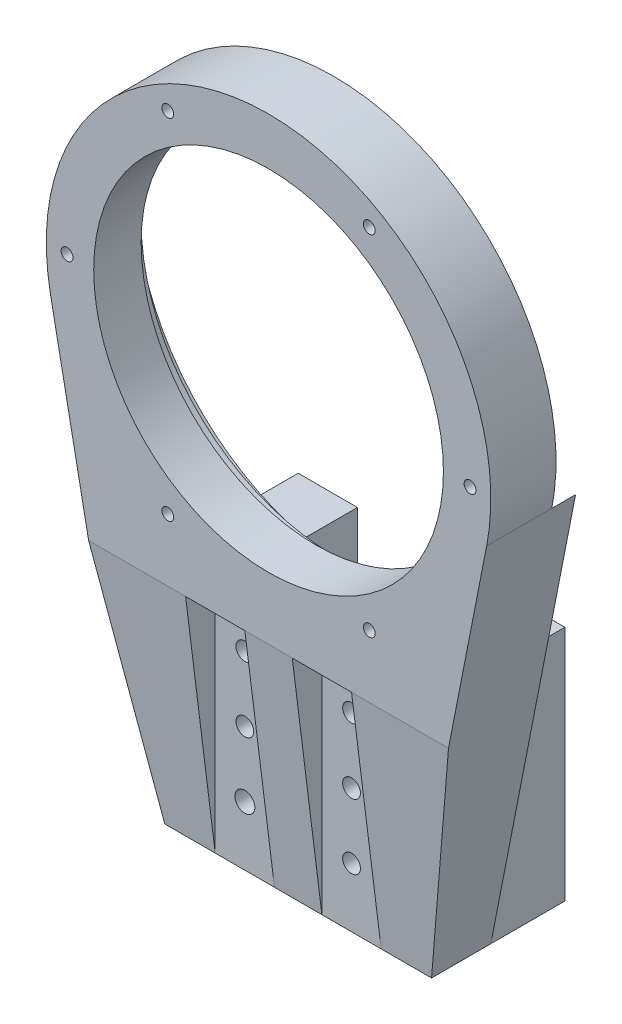
ISO-10303-21;
HEADER;
FILE_DESCRIPTION(('STEP AP214'),'2;1');
FILE_NAME('part.step','',(''),(''),'','','');
FILE_SCHEMA(('AUTOMOTIVE_DESIGN { 1 0 10303 214 1 1 1 1 }'));
ENDSEC;
DATA;
#1=APPLICATION_CONTEXT('core data for automotive mechanical design processes');
#2=APPLICATION_PROTOCOL_DEFINITION('international standard','automotive_design',2000,#1);
#3=PRODUCT_CONTEXT('',#1,'mechanical');
#4=PRODUCT('Part','Part','',(#3));
#5=PRODUCT_RELATED_PRODUCT_CATEGORY('part','',(#4));
#6=PRODUCT_DEFINITION_FORMATION('','',#4);
#7=PRODUCT_DEFINITION_CONTEXT('part definition',#1,'design');
#8=PRODUCT_DEFINITION('design','',#6,#7);
#9=PRODUCT_DEFINITION_SHAPE('','',#8);
#10=(LENGTH_UNIT() NAMED_UNIT(*) SI_UNIT(.MILLI.,.METRE.));
#11=(NAMED_UNIT(*) PLANE_ANGLE_UNIT() SI_UNIT($,.RADIAN.));
#12=(NAMED_UNIT(*) SI_UNIT($,.STERADIAN.) SOLID_ANGLE_UNIT());
#13=UNCERTAINTY_MEASURE_WITH_UNIT(LENGTH_MEASURE(1.E-05),#10,'distance_accuracy_value','');
#14=(GEOMETRIC_REPRESENTATION_CONTEXT(3) GLOBAL_UNCERTAINTY_ASSIGNED_CONTEXT((#13)) GLOBAL_UNIT_ASSIGNED_CONTEXT((#10,
#11,#12)) REPRESENTATION_CONTEXT('',''));
#15=CARTESIAN_POINT('',(0.,0.,0.));
#16=DIRECTION('',(0.,0.,1.));
#17=DIRECTION('',(1.,0.,0.));
#18=AXIS2_PLACEMENT_3D('',#15,#16,#17);
#19=CARTESIAN_POINT('',(0.,0.,0.));
#20=DIRECTION('',(0.,0.,1.));
#21=DIRECTION('',(1.,0.,0.));
#22=AXIS2_PLACEMENT_3D('',#19,#20,#21);
#23=PLANE('',#22);
#24=CARTESIAN_POINT('',(9.00000000000001,-48.,0.));
#25=DIRECTION('',(0.,0.,1.));
#26=DIRECTION('',(1.,0.,0.));
#27=AXIS2_PLACEMENT_3D('',#24,#25,#26);
#28=CIRCLE('',#27,1.5);
#29=CARTESIAN_POINT('',(10.5,-48.,0.));
#30=VERTEX_POINT('',#29);
#31=EDGE_CURVE('E250',#30,#30,#28,.T.);
#32=ORIENTED_EDGE('',*,*,#31,.T.);
#33=EDGE_LOOP('',(#32));
#34=FACE_BOUND('',#33,.T.);
#35=CARTESIAN_POINT('',(9.00000000000001,-59.,0.));
#36=DIRECTION('',(0.,0.,1.));
#37=DIRECTION('',(1.,0.,0.));
#38=AXIS2_PLACEMENT_3D('',#35,#36,#37);
#39=CIRCLE('',#38,1.5);
#40=CARTESIAN_POINT('',(10.5,-59.,0.));
#41=VERTEX_POINT('',#40);
#42=EDGE_CURVE('E244',#41,#41,#39,.T.);
#43=ORIENTED_EDGE('',*,*,#42,.T.);
#44=EDGE_LOOP('',(#43));
#45=FACE_BOUND('',#44,.T.);
#46=CARTESIAN_POINT('',(9.00000000000001,-70.,0.));
#47=DIRECTION('',(0.,0.,1.));
#48=DIRECTION('',(1.,0.,0.));
#49=AXIS2_PLACEMENT_3D('',#46,#47,#48);
#50=CIRCLE('',#49,1.5);
#51=CARTESIAN_POINT('',(10.5,-70.,0.));
#52=VERTEX_POINT('',#51);
#53=EDGE_CURVE('E238',#52,#52,#50,.T.);
#54=ORIENTED_EDGE('',*,*,#53,.T.);
#55=EDGE_LOOP('',(#54));
#56=FACE_BOUND('',#55,.T.);
#57=CARTESIAN_POINT('',(-8.99999999999999,-70.,0.));
#58=DIRECTION('',(0.,0.,1.));
#59=DIRECTION('',(1.,0.,0.));
#60=AXIS2_PLACEMENT_3D('',#57,#58,#59);
#61=CIRCLE('',#60,1.68215715956571);
#62=CARTESIAN_POINT('',(-7.31784284043428,-70.,0.));
#63=VERTEX_POINT('',#62);
#64=EDGE_CURVE('E232',#63,#63,#61,.T.);
#65=ORIENTED_EDGE('',*,*,#64,.T.);
#66=EDGE_LOOP('',(#65));
#67=FACE_BOUND('',#66,.T.);
#68=CARTESIAN_POINT('',(-8.99999999999999,-59.,0.));
#69=DIRECTION('',(0.,0.,1.));
#70=DIRECTION('',(1.,0.,0.));
#71=AXIS2_PLACEMENT_3D('',#68,#69,#70);
#72=CIRCLE('',#71,1.5);
#73=CARTESIAN_POINT('',(-7.49999999999999,-59.,0.));
#74=VERTEX_POINT('',#73);
#75=EDGE_CURVE('E225',#74,#74,#72,.T.);
#76=ORIENTED_EDGE('',*,*,#75,.T.);
#77=EDGE_LOOP('',(#76));
#78=FACE_BOUND('',#77,.T.);
#79=CARTESIAN_POINT('',(-8.99999999999999,-48.,0.));
#80=DIRECTION('',(0.,0.,1.));
#81=DIRECTION('',(1.,0.,0.));
#82=AXIS2_PLACEMENT_3D('',#79,#80,#81);
#83=CIRCLE('',#82,1.5);
#84=CARTESIAN_POINT('',(-7.49999999999999,-48.,0.));
#85=VERTEX_POINT('',#84);
#86=EDGE_CURVE('E255',#85,#85,#83,.T.);
#87=ORIENTED_EDGE('',*,*,#86,.T.);
#88=EDGE_LOOP('',(#87));
#89=FACE_BOUND('',#88,.T.);
#90=DIRECTION('',(0.,1.,0.));
#91=VECTOR('',#90,1.);
#92=CARTESIAN_POINT('',(-22.5,-80.,0.));
#93=LINE('',#92,#91);
#94=CARTESIAN_POINT('',(-22.5,-80.,0.));
#95=VERTEX_POINT('',#94);
#96=CARTESIAN_POINT('',(-22.5,-40.,0.));
#97=VERTEX_POINT('',#96);
#98=EDGE_CURVE('E191',#95,#97,#93,.T.);
#99=ORIENTED_EDGE('',*,*,#98,.F.);
#100=DIRECTION('',(-0.192775433904576,0.98124290167262,0.));
#101=VECTOR('',#100,1.);
#102=CARTESIAN_POINT('',(-36.7966088127232,-7.22907877142159,0.));
#103=LINE('',#102,#101);
#104=CARTESIAN_POINT('',(-36.7966088127232,-7.2290787714216,0.));
#105=VERTEX_POINT('',#104);
#106=EDGE_CURVE('E373',#95,#105,#103,.T.);
#107=ORIENTED_EDGE('',*,*,#106,.T.);
#108=CARTESIAN_POINT('',(0.,0.,0.));
#109=DIRECTION('',(0.,0.,-1.));
#110=DIRECTION('',(-1.,0.,0.));
#111=AXIS2_PLACEMENT_3D('',#108,#109,#110);
#112=CIRCLE('',#111,37.5);
#113=CARTESIAN_POINT('',(36.7966088127232,-7.22907877142159,0.));
#114=VERTEX_POINT('',#113);
#115=EDGE_CURVE('E309',#114,#105,#112,.T.);
#116=ORIENTED_EDGE('',*,*,#115,.F.);
#117=DIRECTION('',(0.192775433904576,0.98124290167262,0.));
#118=VECTOR('',#117,1.);
#119=CARTESIAN_POINT('',(36.7966088127232,-7.22907877142159,0.));
#120=LINE('',#119,#118);
#121=CARTESIAN_POINT('',(22.5,-80.,0.));
#122=VERTEX_POINT('',#121);
#123=EDGE_CURVE('E365',#122,#114,#120,.T.);
#124=ORIENTED_EDGE('',*,*,#123,.F.);
#125=DIRECTION('',(0.,-1.,0.));
#126=VECTOR('',#125,1.);
#127=CARTESIAN_POINT('',(22.5,-80.,0.));
#128=LINE('',#127,#126);
#129=CARTESIAN_POINT('',(22.5,-40.,0.));
#130=VERTEX_POINT('',#129);
#131=EDGE_CURVE('E61',#130,#122,#128,.T.);
#132=ORIENTED_EDGE('',*,*,#131,.F.);
#133=DIRECTION('',(1.,0.,0.));
#134=VECTOR('',#133,1.);
#135=CARTESIAN_POINT('',(22.5,-40.,0.));
#136=LINE('',#135,#134);
#137=CARTESIAN_POINT('',(12.5,-40.,0.));
#138=VERTEX_POINT('',#137);
#139=EDGE_CURVE('E196',#138,#130,#136,.T.);
#140=ORIENTED_EDGE('',*,*,#139,.F.);
#141=DIRECTION('',(0.,1.,0.));
#142=VECTOR('',#141,1.);
#143=CARTESIAN_POINT('',(12.5,-80.,0.));
#144=LINE('',#143,#142);
#145=CARTESIAN_POINT('',(12.5,-80.,0.));
#146=VERTEX_POINT('',#145);
#147=EDGE_CURVE('E193',#146,#138,#144,.T.);
#148=ORIENTED_EDGE('',*,*,#147,.F.);
#149=DIRECTION('',(1.,0.,0.));
#150=VECTOR('',#149,1.);
#151=CARTESIAN_POINT('',(0.,-80.,0.));
#152=LINE('',#151,#150);
#153=CARTESIAN_POINT('',(-12.5,-80.,0.));
#154=VERTEX_POINT('',#153);
#155=EDGE_CURVE('E376',#154,#146,#152,.T.);
#156=ORIENTED_EDGE('',*,*,#155,.F.);
#157=DIRECTION('',(0.,-1.,0.));
#158=VECTOR('',#157,1.);
#159=CARTESIAN_POINT('',(-12.5,-80.,0.));
#160=LINE('',#159,#158);
#161=CARTESIAN_POINT('',(-12.5,-40.,0.));
#162=VERTEX_POINT('',#161);
#163=EDGE_CURVE('E187',#162,#154,#160,.T.);
#164=ORIENTED_EDGE('',*,*,#163,.F.);
#165=DIRECTION('',(1.,0.,0.));
#166=VECTOR('',#165,1.);
#167=CARTESIAN_POINT('',(-22.5,-40.,0.));
#168=LINE('',#167,#166);
#169=EDGE_CURVE('E509',#97,#162,#168,.T.);
#170=ORIENTED_EDGE('',*,*,#169,.F.);
#171=EDGE_LOOP('',(#99,#107,#116,#124,#132,#140,#148,#156,#164,#170));
#172=FACE_BOUND('',#171,.T.);
#173=ADVANCED_FACE('F38',(#34,#45,#56,#67,#78,#89,#172),#23,.F.);
#174=CARTESIAN_POINT('',(35.,-40.,15.));
#175=DIRECTION('',(0.,-0.124034734589208,0.992277876713668));
#176=DIRECTION('',(0.,-0.992277876713668,-0.124034734589208));
#177=AXIS2_PLACEMENT_3D('',#174,#175,#176);
#178=PLANE('',#177);
#179=DIRECTION('',(0.,-0.992277876713668,-0.124034734589208));
#180=VECTOR('',#179,1.);
#181=CARTESIAN_POINT('',(-14.,-40.,15.));
#182=LINE('',#181,#180);
#183=CARTESIAN_POINT('',(-14.,-40.,15.));
#184=VERTEX_POINT('',#183);
#185=CARTESIAN_POINT('',(-14.,-80.,10.));
#186=VERTEX_POINT('',#185);
#187=EDGE_CURVE('E11',#184,#186,#182,.T.);
#188=ORIENTED_EDGE('',*,*,#187,.F.);
#189=DIRECTION('',(1.,0.,0.));
#190=VECTOR('',#189,1.);
#191=CARTESIAN_POINT('',(0.,-40.,15.));
#192=LINE('',#191,#190);
#193=CARTESIAN_POINT('',(-30.3584184843925,-40.,15.));
#194=VERTEX_POINT('',#193);
#195=EDGE_CURVE('E395',#194,#184,#192,.T.);
#196=ORIENTED_EDGE('',*,*,#195,.F.);
#197=DIRECTION('',(-0.191341503775851,0.973944078727149,0.121743009840894));
#198=VECTOR('',#197,1.);
#199=CARTESIAN_POINT('',(-36.7011860732528,-7.71478840706899,19.0356514491164));
#200=LINE('',#199,#198);
#201=CARTESIAN_POINT('',(-22.5,-80.,10.));
#202=VERTEX_POINT('',#201);
#203=EDGE_CURVE('E306',#202,#194,#200,.T.);
#204=ORIENTED_EDGE('',*,*,#203,.F.);
#205=DIRECTION('',(-1.,0.,0.));
#206=VECTOR('',#205,1.);
#207=CARTESIAN_POINT('',(35.,-80.,10.));
#208=LINE('',#207,#206);
#209=EDGE_CURVE('E280',#186,#202,#208,.T.);
#210=ORIENTED_EDGE('',*,*,#209,.F.);
#211=EDGE_LOOP('',(#188,#196,#204,#210));
#212=FACE_BOUND('',#211,.T.);
#213=ADVANCED_FACE('F426',(#212),#178,.T.);
#214=DIRECTION('',(0.,0.992277876713668,0.124034734589208));
#215=VECTOR('',#214,1.);
#216=CARTESIAN_POINT('',(-3.99999999999999,-40.,15.));
#217=LINE('',#216,#215);
#218=CARTESIAN_POINT('',(-3.99999999999999,-80.,10.));
#219=VERTEX_POINT('',#218);
#220=CARTESIAN_POINT('',(-3.99999999999999,-40.,15.));
#221=VERTEX_POINT('',#220);
#222=EDGE_CURVE('E46',#219,#221,#217,.T.);
#223=ORIENTED_EDGE('',*,*,#222,.F.);
#224=CARTESIAN_POINT('',(4.00000000000001,-80.,10.));
#225=VERTEX_POINT('',#224);
#226=EDGE_CURVE('E303',#225,#219,#208,.T.);
#227=ORIENTED_EDGE('',*,*,#226,.F.);
#228=DIRECTION('',(0.,-0.992277876713668,-0.124034734589208));
#229=VECTOR('',#228,1.);
#230=CARTESIAN_POINT('',(4.00000000000001,-40.,15.));
#231=LINE('',#230,#229);
#232=CARTESIAN_POINT('',(4.00000000000001,-40.,15.));
#233=VERTEX_POINT('',#232);
#234=EDGE_CURVE('E402',#233,#225,#231,.T.);
#235=ORIENTED_EDGE('',*,*,#234,.F.);
#236=EDGE_CURVE('E399',#221,#233,#192,.T.);
#237=ORIENTED_EDGE('',*,*,#236,.F.);
#238=EDGE_LOOP('',(#223,#227,#235,#237));
#239=FACE_BOUND('',#238,.T.);
#240=ADVANCED_FACE('F414',(#239),#178,.T.);
#241=CARTESIAN_POINT('',(-36.7966088127232,-7.22907877142159,15.));
#242=DIRECTION('',(-0.98124290167262,-0.192775433904576,0.));
#243=DIRECTION('',(0.192775433904576,-0.98124290167262,0.));
#244=AXIS2_PLACEMENT_3D('',#241,#242,#243);
#245=PLANE('',#244);
#246=DIRECTION('',(0.,0.,-1.));
#247=VECTOR('',#246,1.);
#248=CARTESIAN_POINT('',(-22.5,-80.,15.));
#249=LINE('',#248,#247);
#250=EDGE_CURVE('E384',#202,#95,#249,.T.);
#251=ORIENTED_EDGE('',*,*,#250,.F.);
#252=ORIENTED_EDGE('',*,*,#203,.T.);
#253=DIRECTION('',(-0.192775433904576,0.98124290167262,0.));
#254=VECTOR('',#253,1.);
#255=CARTESIAN_POINT('',(-36.7966088127232,-7.22907877142159,15.));
#256=LINE('',#255,#254);
#257=CARTESIAN_POINT('',(-36.7966088127232,-7.2290787714216,15.));
#258=VERTEX_POINT('',#257);
#259=EDGE_CURVE('E368',#194,#258,#256,.T.);
#260=ORIENTED_EDGE('',*,*,#259,.T.);
#261=DIRECTION('',(0.,0.,-1.));
#262=VECTOR('',#261,1.);
#263=CARTESIAN_POINT('',(-36.7966088127232,-7.2290787714216,15.));
#264=LINE('',#263,#262);
#265=CARTESIAN_POINT('',(-36.7966088127233,-7.2290787714216,4.));
#266=VERTEX_POINT('',#265);
#267=EDGE_CURVE('E387',#258,#266,#264,.T.);
#268=ORIENTED_EDGE('',*,*,#267,.T.);
#269=DIRECTION('',(0.,0.,-1.));
#270=VECTOR('',#269,1.);
#271=CARTESIAN_POINT('',(-36.7966088127233,-7.2290787714216,4.));
#272=LINE('',#271,#270);
#273=EDGE_CURVE('E336',#266,#105,#272,.T.);
#274=ORIENTED_EDGE('',*,*,#273,.T.);
#275=ORIENTED_EDGE('',*,*,#106,.F.);
#276=EDGE_LOOP('',(#251,#252,#260,#268,#274,#275));
#277=FACE_BOUND('',#276,.T.);
#278=ADVANCED_FACE('F477',(#277),#245,.T.);
#279=CARTESIAN_POINT('',(0.,-80.,15.));
#280=DIRECTION('',(0.,1.,0.));
#281=DIRECTION('',(0.,0.,1.));
#282=AXIS2_PLACEMENT_3D('',#279,#280,#281);
#283=PLANE('',#282);
#284=CARTESIAN_POINT('',(22.5,-80.,10.));
#285=VERTEX_POINT('',#284);
#286=CARTESIAN_POINT('',(14.,-80.,10.));
#287=VERTEX_POINT('',#286);
#288=EDGE_CURVE('E299',#285,#287,#208,.T.);
#289=ORIENTED_EDGE('',*,*,#288,.T.);
#290=DIRECTION('',(1.,0.,0.));
#291=VECTOR('',#290,1.);
#292=CARTESIAN_POINT('',(4.00000000000001,-80.,10.));
#293=LINE('',#292,#291);
#294=EDGE_CURVE('E285',#225,#287,#293,.T.);
#295=ORIENTED_EDGE('',*,*,#294,.F.);
#296=ORIENTED_EDGE('',*,*,#226,.T.);
#297=DIRECTION('',(1.,0.,0.));
#298=VECTOR('',#297,1.);
#299=CARTESIAN_POINT('',(-14.,-80.,10.));
#300=LINE('',#299,#298);
#301=EDGE_CURVE('E264',#186,#219,#300,.T.);
#302=ORIENTED_EDGE('',*,*,#301,.F.);
#303=ORIENTED_EDGE('',*,*,#209,.T.);
#304=ORIENTED_EDGE('',*,*,#250,.T.);
#305=DIRECTION('',(0.,0.,1.));
#306=VECTOR('',#305,1.);
#307=CARTESIAN_POINT('',(-22.5,-80.,-12.5));
#308=LINE('',#307,#306);
#309=CARTESIAN_POINT('',(-22.5,-80.,-12.5));
#310=VERTEX_POINT('',#309);
#311=EDGE_CURVE('E504',#310,#95,#308,.T.);
#312=ORIENTED_EDGE('',*,*,#311,.F.);
#313=DIRECTION('',(-1.,0.,0.));
#314=VECTOR('',#313,1.);
#315=CARTESIAN_POINT('',(-22.5,-80.,-12.5));
#316=LINE('',#315,#314);
#317=CARTESIAN_POINT('',(-12.5,-80.,-12.5));
#318=VERTEX_POINT('',#317);
#319=EDGE_CURVE('E184',#318,#310,#316,.T.);
#320=ORIENTED_EDGE('',*,*,#319,.F.);
#321=DIRECTION('',(0.,0.,1.));
#322=VECTOR('',#321,1.);
#323=CARTESIAN_POINT('',(-12.5,-80.,-12.5));
#324=LINE('',#323,#322);
#325=EDGE_CURVE('E53',#318,#154,#324,.T.);
#326=ORIENTED_EDGE('',*,*,#325,.T.);
#327=ORIENTED_EDGE('',*,*,#155,.T.);
#328=DIRECTION('',(0.,0.,1.));
#329=VECTOR('',#328,1.);
#330=CARTESIAN_POINT('',(12.5,-80.,-12.5));
#331=LINE('',#330,#329);
#332=CARTESIAN_POINT('',(12.5,-80.,-12.5));
#333=VERTEX_POINT('',#332);
#334=EDGE_CURVE('E221',#333,#146,#331,.T.);
#335=ORIENTED_EDGE('',*,*,#334,.F.);
#336=DIRECTION('',(-1.,0.,0.));
#337=VECTOR('',#336,1.);
#338=CARTESIAN_POINT('',(12.5,-80.,-12.5));
#339=LINE('',#338,#337);
#340=CARTESIAN_POINT('',(22.5,-80.,-12.5));
#341=VERTEX_POINT('',#340);
#342=EDGE_CURVE('E201',#341,#333,#339,.T.);
#343=ORIENTED_EDGE('',*,*,#342,.F.);
#344=DIRECTION('',(0.,0.,1.));
#345=VECTOR('',#344,1.);
#346=CARTESIAN_POINT('',(22.5,-80.,-12.5));
#347=LINE('',#346,#345);
#348=EDGE_CURVE('E209',#341,#122,#347,.T.);
#349=ORIENTED_EDGE('',*,*,#348,.T.);
#350=DIRECTION('',(0.,0.,-1.));
#351=VECTOR('',#350,1.);
#352=CARTESIAN_POINT('',(22.5,-80.,15.));
#353=LINE('',#352,#351);
#354=EDGE_CURVE('E382',#285,#122,#353,.T.);
#355=ORIENTED_EDGE('',*,*,#354,.F.);
#356=EDGE_LOOP('',(#289,#295,#296,#302,#303,#304,#312,#320,#326,#327,#335,#343,#349,#355));
#357=FACE_BOUND('',#356,.T.);
#358=ADVANCED_FACE('F433',(#357),#283,.F.);
#359=CARTESIAN_POINT('',(36.7966088127232,-7.22907877142159,15.));
#360=DIRECTION('',(-0.98124290167262,0.192775433904576,0.));
#361=DIRECTION('',(-0.192775433904576,-0.98124290167262,0.));
#362=AXIS2_PLACEMENT_3D('',#359,#360,#361);
#363=PLANE('',#362);
#364=DIRECTION('',(0.191341503775851,0.973944078727149,0.121743009840894));
#365=VECTOR('',#364,1.);
#366=CARTESIAN_POINT('',(36.7011860732528,-7.71478840706898,19.0356514491164));
#367=LINE('',#366,#365);
#368=CARTESIAN_POINT('',(30.3584184843925,-40.,15.));
#369=VERTEX_POINT('',#368);
#370=EDGE_CURVE('E302',#285,#369,#367,.T.);
#371=ORIENTED_EDGE('',*,*,#370,.F.);
#372=ORIENTED_EDGE('',*,*,#354,.T.);
#373=ORIENTED_EDGE('',*,*,#123,.T.);
#374=DIRECTION('',(0.,0.,-1.));
#375=VECTOR('',#374,1.);
#376=CARTESIAN_POINT('',(36.7966088127233,-7.22907877142159,4.));
#377=LINE('',#376,#375);
#378=CARTESIAN_POINT('',(36.7966088127233,-7.22907877142159,4.));
#379=VERTEX_POINT('',#378);
#380=EDGE_CURVE('E334',#379,#114,#377,.T.);
#381=ORIENTED_EDGE('',*,*,#380,.F.);
#382=DIRECTION('',(0.,0.,-1.));
#383=VECTOR('',#382,1.);
#384=CARTESIAN_POINT('',(36.7966088127232,-7.22907877142159,15.));
#385=LINE('',#384,#383);
#386=CARTESIAN_POINT('',(36.7966088127232,-7.22907877142159,15.));
#387=VERTEX_POINT('',#386);
#388=EDGE_CURVE('E372',#387,#379,#385,.T.);
#389=ORIENTED_EDGE('',*,*,#388,.F.);
#390=DIRECTION('',(0.192775433904576,0.98124290167262,0.));
#391=VECTOR('',#390,1.);
#392=CARTESIAN_POINT('',(36.7966088127232,-7.22907877142159,15.));
#393=LINE('',#392,#391);
#394=EDGE_CURVE('E370',#369,#387,#393,.T.);
#395=ORIENTED_EDGE('',*,*,#394,.F.);
#396=EDGE_LOOP('',(#371,#372,#373,#381,#389,#395));
#397=FACE_BOUND('',#396,.T.);
#398=ADVANCED_FACE('F471',(#397),#363,.F.);
#399=CARTESIAN_POINT('',(0.,0.,15.));
#400=DIRECTION('',(0.,0.,1.));
#401=DIRECTION('',(1.,0.,0.));
#402=AXIS2_PLACEMENT_3D('',#399,#400,#401);
#403=PLANE('',#402);
#404=CARTESIAN_POINT('',(-17.0000000000002,29.4448637286708,15.));
#405=DIRECTION('',(0.,0.,1.));
#406=DIRECTION('',(1.,0.,0.));
#407=AXIS2_PLACEMENT_3D('',#404,#405,#406);
#408=CIRCLE('',#407,1.00000000000001);
#409=CARTESIAN_POINT('',(-16.0000000000001,29.4448637286708,15.));
#410=VERTEX_POINT('',#409);
#411=EDGE_CURVE('E339',#410,#410,#408,.T.);
#412=ORIENTED_EDGE('',*,*,#411,.F.);
#413=EDGE_LOOP('',(#412));
#414=FACE_BOUND('',#413,.T.);
#415=CARTESIAN_POINT('',(-34.,0.,15.));
#416=DIRECTION('',(0.,0.,1.));
#417=DIRECTION('',(1.,0.,0.));
#418=AXIS2_PLACEMENT_3D('',#415,#416,#417);
#419=CIRCLE('',#418,0.999999999999992);
#420=CARTESIAN_POINT('',(-33.,0.,15.));
#421=VERTEX_POINT('',#420);
#422=EDGE_CURVE('E350',#421,#421,#419,.T.);
#423=ORIENTED_EDGE('',*,*,#422,.F.);
#424=EDGE_LOOP('',(#423));
#425=FACE_BOUND('',#424,.T.);
#426=CARTESIAN_POINT('',(-17.0000000000001,-29.4448637286708,15.));
#427=DIRECTION('',(0.,0.,1.));
#428=DIRECTION('',(1.,0.,0.));
#429=AXIS2_PLACEMENT_3D('',#426,#427,#428);
#430=CIRCLE('',#429,0.999999999999999);
#431=CARTESIAN_POINT('',(-16.0000000000001,-29.4448637286708,15.));
#432=VERTEX_POINT('',#431);
#433=EDGE_CURVE('E347',#432,#432,#430,.T.);
#434=ORIENTED_EDGE('',*,*,#433,.F.);
#435=EDGE_LOOP('',(#434));
#436=FACE_BOUND('',#435,.T.);
#437=CARTESIAN_POINT('',(17.0000000000001,-29.4448637286708,15.));
#438=DIRECTION('',(0.,0.,1.));
#439=DIRECTION('',(1.,0.,0.));
#440=AXIS2_PLACEMENT_3D('',#437,#438,#439);
#441=CIRCLE('',#440,0.999999999999994);
#442=CARTESIAN_POINT('',(18.0000000000001,-29.4448637286708,15.));
#443=VERTEX_POINT('',#442);
#444=EDGE_CURVE('E344',#443,#443,#441,.T.);
#445=ORIENTED_EDGE('',*,*,#444,.F.);
#446=EDGE_LOOP('',(#445));
#447=FACE_BOUND('',#446,.T.);
#448=CARTESIAN_POINT('',(34.,0.,15.));
#449=DIRECTION('',(0.,0.,1.));
#450=DIRECTION('',(1.,0.,0.));
#451=AXIS2_PLACEMENT_3D('',#448,#449,#450);
#452=CIRCLE('',#451,0.999999999999998);
#453=CARTESIAN_POINT('',(35.,0.,15.));
#454=VERTEX_POINT('',#453);
#455=EDGE_CURVE('E340',#454,#454,#452,.T.);
#456=ORIENTED_EDGE('',*,*,#455,.F.);
#457=EDGE_LOOP('',(#456));
#458=FACE_BOUND('',#457,.T.);
#459=CARTESIAN_POINT('',(17.0000000000001,29.4448637286708,15.));
#460=DIRECTION('',(0.,0.,1.));
#461=DIRECTION('',(1.,0.,0.));
#462=AXIS2_PLACEMENT_3D('',#459,#460,#461);
#463=CIRCLE('',#462,1.00000000000001);
#464=CARTESIAN_POINT('',(18.0000000000001,29.4448637286708,15.));
#465=VERTEX_POINT('',#464);
#466=EDGE_CURVE('E343',#465,#465,#463,.T.);
#467=ORIENTED_EDGE('',*,*,#466,.F.);
#468=EDGE_LOOP('',(#467));
#469=FACE_BOUND('',#468,.T.);
#470=CARTESIAN_POINT('',(0.,0.,15.));
#471=DIRECTION('',(0.,0.,1.));
#472=DIRECTION('',(1.,0.,0.));
#473=AXIS2_PLACEMENT_3D('',#470,#471,#472);
#474=CIRCLE('',#473,29.5);
#475=CARTESIAN_POINT('',(29.5,0.,15.));
#476=VERTEX_POINT('',#475);
#477=EDGE_CURVE('E361',#476,#476,#474,.T.);
#478=ORIENTED_EDGE('',*,*,#477,.F.);
#479=EDGE_LOOP('',(#478));
#480=FACE_BOUND('',#479,.T.);
#481=ORIENTED_EDGE('',*,*,#259,.F.);
#482=ORIENTED_EDGE('',*,*,#195,.T.);
#483=DIRECTION('',(-1.,0.,0.));
#484=VECTOR('',#483,1.);
#485=CARTESIAN_POINT('',(-14.,-40.,15.));
#486=LINE('',#485,#484);
#487=EDGE_CURVE('E265',#221,#184,#486,.T.);
#488=ORIENTED_EDGE('',*,*,#487,.F.);
#489=ORIENTED_EDGE('',*,*,#236,.T.);
#490=DIRECTION('',(-1.,0.,0.));
#491=VECTOR('',#490,1.);
#492=CARTESIAN_POINT('',(4.00000000000001,-40.,15.));
#493=LINE('',#492,#491);
#494=CARTESIAN_POINT('',(14.,-40.,15.));
#495=VERTEX_POINT('',#494);
#496=EDGE_CURVE('E258',#495,#233,#493,.T.);
#497=ORIENTED_EDGE('',*,*,#496,.F.);
#498=EDGE_CURVE('E390',#495,#369,#192,.T.);
#499=ORIENTED_EDGE('',*,*,#498,.T.);
#500=ORIENTED_EDGE('',*,*,#394,.T.);
#501=CARTESIAN_POINT('',(0.,0.,15.));
#502=DIRECTION('',(0.,0.,1.));
#503=DIRECTION('',(1.,0.,0.));
#504=AXIS2_PLACEMENT_3D('',#501,#502,#503);
#505=CIRCLE('',#504,37.5);
#506=EDGE_CURVE('E364',#387,#258,#505,.T.);
#507=ORIENTED_EDGE('',*,*,#506,.T.);
#508=EDGE_LOOP('',(#481,#482,#488,#489,#497,#499,#500,#507));
#509=FACE_BOUND('',#508,.T.);
#510=ADVANCED_FACE('F418',(#414,#425,#436,#447,#458,#469,#480,#509),#403,.T.);
#511=CARTESIAN_POINT('',(0.,0.,15.));
#512=DIRECTION('',(0.,0.,-1.));
#513=DIRECTION('',(-1.,0.,0.));
#514=AXIS2_PLACEMENT_3D('',#511,#512,#513);
#515=CYLINDRICAL_SURFACE('',#514,37.5);
#516=CARTESIAN_POINT('',(0.,0.,4.));
#517=DIRECTION('',(0.,0.,-1.));
#518=DIRECTION('',(-1.,0.,0.));
#519=AXIS2_PLACEMENT_3D('',#516,#517,#518);
#520=CIRCLE('',#519,37.5);
#521=EDGE_CURVE('E314',#266,#379,#520,.T.);
#522=ORIENTED_EDGE('',*,*,#521,.F.);
#523=ORIENTED_EDGE('',*,*,#267,.F.);
#524=ORIENTED_EDGE('',*,*,#506,.F.);
#525=ORIENTED_EDGE('',*,*,#388,.T.);
#526=EDGE_LOOP('',(#522,#523,#524,#525));
#527=FACE_BOUND('',#526,.T.);
#528=ADVANCED_FACE('F480',(#527),#515,.T.);
#529=CARTESIAN_POINT('',(0.,0.,7.));
#530=DIRECTION('',(0.,0.,-1.));
#531=DIRECTION('',(-1.,0.,0.));
#532=AXIS2_PLACEMENT_3D('',#529,#530,#531);
#533=CYLINDRICAL_SURFACE('',#532,32.5);
#534=CARTESIAN_POINT('',(0.,0.,7.));
#535=DIRECTION('',(0.,0.,-1.));
#536=DIRECTION('',(-1.,0.,0.));
#537=AXIS2_PLACEMENT_3D('',#534,#535,#536);
#538=CIRCLE('',#537,32.5);
#539=CARTESIAN_POINT('',(-32.5,0.,7.));
#540=VERTEX_POINT('',#539);
#541=EDGE_CURVE('E357',#540,#540,#538,.T.);
#542=ORIENTED_EDGE('',*,*,#541,.F.);
#543=EDGE_LOOP('',(#542));
#544=FACE_BOUND('',#543,.T.);
#545=CARTESIAN_POINT('',(0.,0.,4.));
#546=DIRECTION('',(0.,0.,-1.));
#547=DIRECTION('',(-1.,0.,0.));
#548=AXIS2_PLACEMENT_3D('',#545,#546,#547);
#549=CIRCLE('',#548,32.5);
#550=CARTESIAN_POINT('',(-32.5,0.,4.));
#551=VERTEX_POINT('',#550);
#552=EDGE_CURVE('E331',#551,#551,#549,.F.);
#553=ORIENTED_EDGE('',*,*,#552,.F.);
#554=EDGE_LOOP('',(#553));
#555=FACE_BOUND('',#554,.T.);
#556=ADVANCED_FACE('F482',(#544,#555),#533,.F.);
#557=CARTESIAN_POINT('',(17.0000000000001,29.4448637286708,0.));
#558=DIRECTION('',(0.,0.,1.));
#559=DIRECTION('',(1.,0.,0.));
#560=AXIS2_PLACEMENT_3D('',#557,#558,#559);
#561=CYLINDRICAL_SURFACE('',#560,1.00000000000001);
#562=ORIENTED_EDGE('',*,*,#466,.T.);
#563=EDGE_LOOP('',(#562));
#564=FACE_BOUND('',#563,.T.);
#565=CARTESIAN_POINT('',(17.0000000000001,29.4448637286708,4.));
#566=DIRECTION('',(0.,0.,-1.));
#567=DIRECTION('',(-1.,0.,0.));
#568=AXIS2_PLACEMENT_3D('',#565,#566,#567);
#569=CIRCLE('',#568,1.00000000000001);
#570=CARTESIAN_POINT('',(16.0000000000001,29.4448637286708,4.));
#571=VERTEX_POINT('',#570);
#572=EDGE_CURVE('E328',#571,#571,#569,.F.);
#573=ORIENTED_EDGE('',*,*,#572,.F.);
#574=EDGE_LOOP('',(#573));
#575=FACE_BOUND('',#574,.T.);
#576=ADVANCED_FACE('F488',(#564,#575),#561,.F.);
#577=CARTESIAN_POINT('',(34.,0.,0.));
#578=DIRECTION('',(0.,0.,1.));
#579=DIRECTION('',(1.,0.,0.));
#580=AXIS2_PLACEMENT_3D('',#577,#578,#579);
#581=CYLINDRICAL_SURFACE('',#580,0.999999999999998);
#582=ORIENTED_EDGE('',*,*,#455,.T.);
#583=EDGE_LOOP('',(#582));
#584=FACE_BOUND('',#583,.T.);
#585=CARTESIAN_POINT('',(34.,0.,4.));
#586=DIRECTION('',(0.,0.,-1.));
#587=DIRECTION('',(-1.,0.,0.));
#588=AXIS2_PLACEMENT_3D('',#585,#586,#587);
#589=CIRCLE('',#588,0.999999999999998);
#590=CARTESIAN_POINT('',(33.,0.,4.));
#591=VERTEX_POINT('',#590);
#592=EDGE_CURVE('E325',#591,#591,#589,.F.);
#593=ORIENTED_EDGE('',*,*,#592,.F.);
#594=EDGE_LOOP('',(#593));
#595=FACE_BOUND('',#594,.T.);
#596=ADVANCED_FACE('F811',(#584,#595),#581,.F.);
#597=CARTESIAN_POINT('',(17.0000000000001,-29.4448637286708,0.));
#598=DIRECTION('',(0.,0.,1.));
#599=DIRECTION('',(1.,0.,0.));
#600=AXIS2_PLACEMENT_3D('',#597,#598,#599);
#601=CYLINDRICAL_SURFACE('',#600,0.999999999999994);
#602=ORIENTED_EDGE('',*,*,#444,.T.);
#603=EDGE_LOOP('',(#602));
#604=FACE_BOUND('',#603,.T.);
#605=CARTESIAN_POINT('',(17.0000000000001,-29.4448637286708,4.));
#606=DIRECTION('',(0.,0.,-1.));
#607=DIRECTION('',(-1.,0.,0.));
#608=AXIS2_PLACEMENT_3D('',#605,#606,#607);
#609=CIRCLE('',#608,0.999999999999994);
#610=CARTESIAN_POINT('',(16.0000000000002,-29.4448637286708,4.));
#611=VERTEX_POINT('',#610);
#612=EDGE_CURVE('E322',#611,#611,#609,.F.);
#613=ORIENTED_EDGE('',*,*,#612,.F.);
#614=EDGE_LOOP('',(#613));
#615=FACE_BOUND('',#614,.T.);
#616=ADVANCED_FACE('F821',(#604,#615),#601,.F.);
#617=CARTESIAN_POINT('',(-17.0000000000001,-29.4448637286708,0.));
#618=DIRECTION('',(0.,0.,1.));
#619=DIRECTION('',(1.,0.,0.));
#620=AXIS2_PLACEMENT_3D('',#617,#618,#619);
#621=CYLINDRICAL_SURFACE('',#620,0.999999999999999);
#622=ORIENTED_EDGE('',*,*,#433,.T.);
#623=EDGE_LOOP('',(#622));
#624=FACE_BOUND('',#623,.T.);
#625=CARTESIAN_POINT('',(-17.0000000000001,-29.4448637286708,4.));
#626=DIRECTION('',(0.,0.,-1.));
#627=DIRECTION('',(-1.,0.,0.));
#628=AXIS2_PLACEMENT_3D('',#625,#626,#627);
#629=CIRCLE('',#628,0.999999999999999);
#630=CARTESIAN_POINT('',(-18.0000000000001,-29.4448637286708,4.));
#631=VERTEX_POINT('',#630);
#632=EDGE_CURVE('E319',#631,#631,#629,.F.);
#633=ORIENTED_EDGE('',*,*,#632,.F.);
#634=EDGE_LOOP('',(#633));
#635=FACE_BOUND('',#634,.T.);
#636=ADVANCED_FACE('F831',(#624,#635),#621,.F.);
#637=CARTESIAN_POINT('',(-34.,0.,0.));
#638=DIRECTION('',(0.,0.,1.));
#639=DIRECTION('',(1.,0.,0.));
#640=AXIS2_PLACEMENT_3D('',#637,#638,#639);
#641=CYLINDRICAL_SURFACE('',#640,0.999999999999992);
#642=ORIENTED_EDGE('',*,*,#422,.T.);
#643=EDGE_LOOP('',(#642));
#644=FACE_BOUND('',#643,.T.);
#645=CARTESIAN_POINT('',(-34.,0.,4.));
#646=DIRECTION('',(0.,0.,-1.));
#647=DIRECTION('',(-1.,0.,0.));
#648=AXIS2_PLACEMENT_3D('',#645,#646,#647);
#649=CIRCLE('',#648,0.999999999999992);
#650=CARTESIAN_POINT('',(-35.,0.,4.));
#651=VERTEX_POINT('',#650);
#652=EDGE_CURVE('E316',#651,#651,#649,.F.);
#653=ORIENTED_EDGE('',*,*,#652,.F.);
#654=EDGE_LOOP('',(#653));
#655=FACE_BOUND('',#654,.T.);
#656=ADVANCED_FACE('F841',(#644,#655),#641,.F.);
#657=CARTESIAN_POINT('',(-17.0000000000002,29.4448637286708,0.));
#658=DIRECTION('',(0.,0.,1.));
#659=DIRECTION('',(1.,0.,0.));
#660=AXIS2_PLACEMENT_3D('',#657,#658,#659);
#661=CYLINDRICAL_SURFACE('',#660,1.00000000000001);
#662=ORIENTED_EDGE('',*,*,#411,.T.);
#663=EDGE_LOOP('',(#662));
#664=FACE_BOUND('',#663,.T.);
#665=CARTESIAN_POINT('',(-17.0000000000002,29.4448637286708,4.));
#666=DIRECTION('',(0.,0.,-1.));
#667=DIRECTION('',(-1.,0.,0.));
#668=AXIS2_PLACEMENT_3D('',#665,#666,#667);
#669=CIRCLE('',#668,1.00000000000001);
#670=CARTESIAN_POINT('',(-18.0000000000002,29.4448637286708,4.));
#671=VERTEX_POINT('',#670);
#672=EDGE_CURVE('E313',#671,#671,#669,.F.);
#673=ORIENTED_EDGE('',*,*,#672,.F.);
#674=EDGE_LOOP('',(#673));
#675=FACE_BOUND('',#674,.T.);
#676=ADVANCED_FACE('F850',(#664,#675),#661,.F.);
#677=CARTESIAN_POINT('',(0.,0.,15.));
#678=DIRECTION('',(0.,0.,-1.));
#679=DIRECTION('',(-1.,0.,0.));
#680=AXIS2_PLACEMENT_3D('',#677,#678,#679);
#681=CYLINDRICAL_SURFACE('',#680,29.5);
#682=ORIENTED_EDGE('',*,*,#477,.T.);
#683=EDGE_LOOP('',(#682));
#684=FACE_BOUND('',#683,.T.);
#685=CARTESIAN_POINT('',(0.,0.,7.));
#686=DIRECTION('',(0.,0.,-1.));
#687=DIRECTION('',(-1.,0.,0.));
#688=AXIS2_PLACEMENT_3D('',#685,#686,#687);
#689=CIRCLE('',#688,29.5);
#690=CARTESIAN_POINT('',(-29.5,0.,7.));
#691=VERTEX_POINT('',#690);
#692=EDGE_CURVE('E360',#691,#691,#689,.T.);
#693=ORIENTED_EDGE('',*,*,#692,.T.);
#694=EDGE_LOOP('',(#693));
#695=FACE_BOUND('',#694,.T.);
#696=ADVANCED_FACE('F40',(#684,#695),#681,.F.);
#697=CARTESIAN_POINT('',(0.,0.,7.));
#698=DIRECTION('',(0.,0.,-1.));
#699=DIRECTION('',(-1.,0.,0.));
#700=AXIS2_PLACEMENT_3D('',#697,#698,#699);
#701=PLANE('',#700);
#702=ORIENTED_EDGE('',*,*,#692,.F.);
#703=EDGE_LOOP('',(#702));
#704=FACE_BOUND('',#703,.T.);
#705=ORIENTED_EDGE('',*,*,#541,.T.);
#706=EDGE_LOOP('',(#705));
#707=FACE_BOUND('',#706,.T.);
#708=ADVANCED_FACE('F785',(#704,#707),#701,.T.);
#709=CARTESIAN_POINT('',(0.,0.,4.));
#710=DIRECTION('',(0.,0.,-1.));
#711=DIRECTION('',(-1.,0.,0.));
#712=AXIS2_PLACEMENT_3D('',#709,#710,#711);
#713=CYLINDRICAL_SURFACE('',#712,37.5);
#714=EDGE_CURVE('E310',#379,#266,#520,.T.);
#715=ORIENTED_EDGE('',*,*,#714,.F.);
#716=ORIENTED_EDGE('',*,*,#380,.T.);
#717=ORIENTED_EDGE('',*,*,#115,.T.);
#718=ORIENTED_EDGE('',*,*,#273,.F.);
#719=EDGE_LOOP('',(#715,#716,#717,#718));
#720=FACE_BOUND('',#719,.T.);
#721=ADVANCED_FACE('F503',(#720),#713,.F.);
#722=CARTESIAN_POINT('',(0.,0.,4.));
#723=DIRECTION('',(0.,0.,-1.));
#724=DIRECTION('',(-1.,0.,0.));
#725=AXIS2_PLACEMENT_3D('',#722,#723,#724);
#726=PLANE('',#725);
#727=ORIENTED_EDGE('',*,*,#714,.T.);
#728=ORIENTED_EDGE('',*,*,#521,.T.);
#729=EDGE_LOOP('',(#727,#728));
#730=FACE_BOUND('',#729,.T.);
#731=ORIENTED_EDGE('',*,*,#672,.T.);
#732=EDGE_LOOP('',(#731));
#733=FACE_BOUND('',#732,.T.);
#734=ORIENTED_EDGE('',*,*,#652,.T.);
#735=EDGE_LOOP('',(#734));
#736=FACE_BOUND('',#735,.T.);
#737=ORIENTED_EDGE('',*,*,#632,.T.);
#738=EDGE_LOOP('',(#737));
#739=FACE_BOUND('',#738,.T.);
#740=ORIENTED_EDGE('',*,*,#612,.T.);
#741=EDGE_LOOP('',(#740));
#742=FACE_BOUND('',#741,.T.);
#743=ORIENTED_EDGE('',*,*,#592,.T.);
#744=EDGE_LOOP('',(#743));
#745=FACE_BOUND('',#744,.T.);
#746=ORIENTED_EDGE('',*,*,#572,.T.);
#747=EDGE_LOOP('',(#746));
#748=FACE_BOUND('',#747,.T.);
#749=ORIENTED_EDGE('',*,*,#552,.T.);
#750=EDGE_LOOP('',(#749));
#751=FACE_BOUND('',#750,.T.);
#752=ADVANCED_FACE('F458',(#730,#733,#736,#739,#742,#745,#748,#751),#726,.T.);
#753=DIRECTION('',(0.,0.992277876713668,0.124034734589208));
#754=VECTOR('',#753,1.);
#755=CARTESIAN_POINT('',(14.,-40.,15.));
#756=LINE('',#755,#754);
#757=EDGE_CURVE('E398',#287,#495,#756,.T.);
#758=ORIENTED_EDGE('',*,*,#757,.F.);
#759=ORIENTED_EDGE('',*,*,#288,.F.);
#760=ORIENTED_EDGE('',*,*,#370,.T.);
#761=ORIENTED_EDGE('',*,*,#498,.F.);
#762=EDGE_LOOP('',(#758,#759,#760,#761));
#763=FACE_BOUND('',#762,.T.);
#764=ADVANCED_FACE('F443',(#763),#178,.T.);
#765=CARTESIAN_POINT('',(4.00000000000001,-80.,10.));
#766=DIRECTION('',(-1.,0.,0.));
#767=DIRECTION('',(0.,-1.,0.));
#768=AXIS2_PLACEMENT_3D('',#765,#766,#767);
#769=PLANE('',#768);
#770=ORIENTED_EDGE('',*,*,#234,.T.);
#771=DIRECTION('',(0.,-1.,0.));
#772=VECTOR('',#771,1.);
#773=CARTESIAN_POINT('',(4.00000000000001,-80.,10.));
#774=LINE('',#773,#772);
#775=CARTESIAN_POINT('',(4.00000000000001,-40.,10.));
#776=VERTEX_POINT('',#775);
#777=EDGE_CURVE('E282',#776,#225,#774,.T.);
#778=ORIENTED_EDGE('',*,*,#777,.F.);
#779=DIRECTION('',(0.,0.,1.));
#780=VECTOR('',#779,1.);
#781=CARTESIAN_POINT('',(4.00000000000001,-40.,10.));
#782=LINE('',#781,#780);
#783=EDGE_CURVE('E277',#776,#233,#782,.T.);
#784=ORIENTED_EDGE('',*,*,#783,.T.);
#785=EDGE_LOOP('',(#770,#778,#784));
#786=FACE_BOUND('',#785,.T.);
#787=ADVANCED_FACE('F450',(#786),#769,.F.);
#788=CARTESIAN_POINT('',(4.00000000000001,-40.,10.));
#789=DIRECTION('',(0.,1.,0.));
#790=DIRECTION('',(0.,0.,1.));
#791=AXIS2_PLACEMENT_3D('',#788,#789,#790);
#792=PLANE('',#791);
#793=ORIENTED_EDGE('',*,*,#496,.T.);
#794=ORIENTED_EDGE('',*,*,#783,.F.);
#795=DIRECTION('',(-1.,0.,0.));
#796=VECTOR('',#795,1.);
#797=CARTESIAN_POINT('',(4.00000000000001,-40.,10.));
#798=LINE('',#797,#796);
#799=CARTESIAN_POINT('',(14.,-40.,10.));
#800=VERTEX_POINT('',#799);
#801=EDGE_CURVE('E291',#800,#776,#798,.T.);
#802=ORIENTED_EDGE('',*,*,#801,.F.);
#803=DIRECTION('',(0.,0.,1.));
#804=VECTOR('',#803,1.);
#805=CARTESIAN_POINT('',(14.,-40.,10.));
#806=LINE('',#805,#804);
#807=EDGE_CURVE('E294',#800,#495,#806,.T.);
#808=ORIENTED_EDGE('',*,*,#807,.T.);
#809=EDGE_LOOP('',(#793,#794,#802,#808));
#810=FACE_BOUND('',#809,.T.);
#811=ADVANCED_FACE('F448',(#810),#792,.F.);
#812=CARTESIAN_POINT('',(14.,-80.,10.));
#813=DIRECTION('',(1.,0.,0.));
#814=DIRECTION('',(0.,0.,-1.));
#815=AXIS2_PLACEMENT_3D('',#812,#813,#814);
#816=PLANE('',#815);
#817=ORIENTED_EDGE('',*,*,#757,.T.);
#818=ORIENTED_EDGE('',*,*,#807,.F.);
#819=DIRECTION('',(0.,1.,0.));
#820=VECTOR('',#819,1.);
#821=CARTESIAN_POINT('',(14.,-80.,10.));
#822=LINE('',#821,#820);
#823=EDGE_CURVE('E288',#287,#800,#822,.T.);
#824=ORIENTED_EDGE('',*,*,#823,.F.);
#825=EDGE_LOOP('',(#817,#818,#824));
#826=FACE_BOUND('',#825,.T.);
#827=ADVANCED_FACE('F446',(#826),#816,.F.);
#828=CARTESIAN_POINT('',(0.,0.,10.));
#829=DIRECTION('',(0.,0.,-1.));
#830=DIRECTION('',(-1.,0.,0.));
#831=AXIS2_PLACEMENT_3D('',#828,#829,#830);
#832=PLANE('',#831);
#833=CARTESIAN_POINT('',(9.00000000000001,-48.,10.));
#834=DIRECTION('',(0.,0.,1.));
#835=DIRECTION('',(1.,0.,0.));
#836=AXIS2_PLACEMENT_3D('',#833,#834,#835);
#837=CIRCLE('',#836,1.5);
#838=CARTESIAN_POINT('',(10.5,-48.,10.));
#839=VERTEX_POINT('',#838);
#840=EDGE_CURVE('E224',#839,#839,#837,.T.);
#841=ORIENTED_EDGE('',*,*,#840,.F.);
#842=EDGE_LOOP('',(#841));
#843=FACE_BOUND('',#842,.T.);
#844=CARTESIAN_POINT('',(9.00000000000001,-59.,10.));
#845=DIRECTION('',(0.,0.,1.));
#846=DIRECTION('',(1.,0.,0.));
#847=AXIS2_PLACEMENT_3D('',#844,#845,#846);
#848=CIRCLE('',#847,1.5);
#849=CARTESIAN_POINT('',(10.5,-59.,10.));
#850=VERTEX_POINT('',#849);
#851=EDGE_CURVE('E247',#850,#850,#848,.T.);
#852=ORIENTED_EDGE('',*,*,#851,.F.);
#853=EDGE_LOOP('',(#852));
#854=FACE_BOUND('',#853,.T.);
#855=CARTESIAN_POINT('',(9.00000000000001,-70.,10.));
#856=DIRECTION('',(0.,0.,1.));
#857=DIRECTION('',(1.,0.,0.));
#858=AXIS2_PLACEMENT_3D('',#855,#856,#857);
#859=CIRCLE('',#858,1.5);
#860=CARTESIAN_POINT('',(10.5,-70.,10.));
#861=VERTEX_POINT('',#860);
#862=EDGE_CURVE('E241',#861,#861,#859,.T.);
#863=ORIENTED_EDGE('',*,*,#862,.F.);
#864=EDGE_LOOP('',(#863));
#865=FACE_BOUND('',#864,.T.);
#866=ORIENTED_EDGE('',*,*,#777,.T.);
#867=ORIENTED_EDGE('',*,*,#294,.T.);
#868=ORIENTED_EDGE('',*,*,#823,.T.);
#869=ORIENTED_EDGE('',*,*,#801,.T.);
#870=EDGE_LOOP('',(#866,#867,#868,#869));
#871=FACE_BOUND('',#870,.T.);
#872=ADVANCED_FACE('F438',(#843,#854,#865,#871),#832,.F.);
#873=CARTESIAN_POINT('',(-14.,-80.,10.));
#874=DIRECTION('',(-1.,0.,0.));
#875=DIRECTION('',(0.,-1.,0.));
#876=AXIS2_PLACEMENT_3D('',#873,#874,#875);
#877=PLANE('',#876);
#878=ORIENTED_EDGE('',*,*,#187,.T.);
#879=DIRECTION('',(0.,-1.,0.));
#880=VECTOR('',#879,1.);
#881=CARTESIAN_POINT('',(-14.,-80.,10.));
#882=LINE('',#881,#880);
#883=CARTESIAN_POINT('',(-14.,-40.,10.));
#884=VERTEX_POINT('',#883);
#885=EDGE_CURVE('E261',#884,#186,#882,.T.);
#886=ORIENTED_EDGE('',*,*,#885,.F.);
#887=DIRECTION('',(0.,0.,1.));
#888=VECTOR('',#887,1.);
#889=CARTESIAN_POINT('',(-14.,-40.,10.));
#890=LINE('',#889,#888);
#891=EDGE_CURVE('E278',#884,#184,#890,.T.);
#892=ORIENTED_EDGE('',*,*,#891,.T.);
#893=EDGE_LOOP('',(#878,#886,#892));
#894=FACE_BOUND('',#893,.T.);
#895=ADVANCED_FACE('F430',(#894),#877,.F.);
#896=CARTESIAN_POINT('',(-14.,-40.,10.));
#897=DIRECTION('',(0.,1.,0.));
#898=DIRECTION('',(0.,0.,1.));
#899=AXIS2_PLACEMENT_3D('',#896,#897,#898);
#900=PLANE('',#899);
#901=ORIENTED_EDGE('',*,*,#487,.T.);
#902=ORIENTED_EDGE('',*,*,#891,.F.);
#903=DIRECTION('',(-1.,0.,0.));
#904=VECTOR('',#903,1.);
#905=CARTESIAN_POINT('',(-14.,-40.,10.));
#906=LINE('',#905,#904);
#907=CARTESIAN_POINT('',(-3.99999999999999,-40.,10.));
#908=VERTEX_POINT('',#907);
#909=EDGE_CURVE('E271',#908,#884,#906,.T.);
#910=ORIENTED_EDGE('',*,*,#909,.F.);
#911=DIRECTION('',(0.,0.,1.));
#912=VECTOR('',#911,1.);
#913=CARTESIAN_POINT('',(-3.99999999999999,-40.,10.));
#914=LINE('',#913,#912);
#915=EDGE_CURVE('E274',#908,#221,#914,.T.);
#916=ORIENTED_EDGE('',*,*,#915,.T.);
#917=EDGE_LOOP('',(#901,#902,#910,#916));
#918=FACE_BOUND('',#917,.T.);
#919=ADVANCED_FACE('F421',(#918),#900,.F.);
#920=CARTESIAN_POINT('',(-3.99999999999999,-80.,10.));
#921=DIRECTION('',(1.,0.,0.));
#922=DIRECTION('',(0.,1.,0.));
#923=AXIS2_PLACEMENT_3D('',#920,#921,#922);
#924=PLANE('',#923);
#925=ORIENTED_EDGE('',*,*,#222,.T.);
#926=ORIENTED_EDGE('',*,*,#915,.F.);
#927=DIRECTION('',(0.,1.,0.));
#928=VECTOR('',#927,1.);
#929=CARTESIAN_POINT('',(-3.99999999999999,-80.,10.));
#930=LINE('',#929,#928);
#931=EDGE_CURVE('E268',#219,#908,#930,.T.);
#932=ORIENTED_EDGE('',*,*,#931,.F.);
#933=EDGE_LOOP('',(#925,#926,#932));
#934=FACE_BOUND('',#933,.T.);
#935=ADVANCED_FACE('F407',(#934),#924,.F.);
#936=CARTESIAN_POINT('',(0.,0.,10.));
#937=DIRECTION('',(0.,0.,-1.));
#938=DIRECTION('',(-1.,0.,0.));
#939=AXIS2_PLACEMENT_3D('',#936,#937,#938);
#940=PLANE('',#939);
#941=CARTESIAN_POINT('',(-8.99999999999999,-70.,10.));
#942=DIRECTION('',(0.,0.,1.));
#943=DIRECTION('',(1.,0.,0.));
#944=AXIS2_PLACEMENT_3D('',#941,#942,#943);
#945=CIRCLE('',#944,1.68215715956571);
#946=CARTESIAN_POINT('',(-7.31784284043428,-70.,10.));
#947=VERTEX_POINT('',#946);
#948=EDGE_CURVE('E235',#947,#947,#945,.T.);
#949=ORIENTED_EDGE('',*,*,#948,.F.);
#950=EDGE_LOOP('',(#949));
#951=FACE_BOUND('',#950,.T.);
#952=CARTESIAN_POINT('',(-8.99999999999999,-59.,10.));
#953=DIRECTION('',(0.,0.,1.));
#954=DIRECTION('',(1.,0.,0.));
#955=AXIS2_PLACEMENT_3D('',#952,#953,#954);
#956=CIRCLE('',#955,1.5);
#957=CARTESIAN_POINT('',(-7.49999999999999,-59.,10.));
#958=VERTEX_POINT('',#957);
#959=EDGE_CURVE('E229',#958,#958,#956,.T.);
#960=ORIENTED_EDGE('',*,*,#959,.F.);
#961=EDGE_LOOP('',(#960));
#962=FACE_BOUND('',#961,.T.);
#963=CARTESIAN_POINT('',(-8.99999999999999,-48.,10.));
#964=DIRECTION('',(0.,0.,1.));
#965=DIRECTION('',(1.,0.,0.));
#966=AXIS2_PLACEMENT_3D('',#963,#964,#965);
#967=CIRCLE('',#966,1.5);
#968=CARTESIAN_POINT('',(-7.49999999999999,-48.,10.));
#969=VERTEX_POINT('',#968);
#970=EDGE_CURVE('E228',#969,#969,#967,.T.);
#971=ORIENTED_EDGE('',*,*,#970,.F.);
#972=EDGE_LOOP('',(#971));
#973=FACE_BOUND('',#972,.T.);
#974=ORIENTED_EDGE('',*,*,#885,.T.);
#975=ORIENTED_EDGE('',*,*,#301,.T.);
#976=ORIENTED_EDGE('',*,*,#931,.T.);
#977=ORIENTED_EDGE('',*,*,#909,.T.);
#978=EDGE_LOOP('',(#974,#975,#976,#977));
#979=FACE_BOUND('',#978,.T.);
#980=ADVANCED_FACE('F432',(#951,#962,#973,#979),#940,.F.);
#981=CARTESIAN_POINT('',(-8.99999999999999,-48.,0.));
#982=DIRECTION('',(0.,0.,1.));
#983=DIRECTION('',(1.,0.,0.));
#984=AXIS2_PLACEMENT_3D('',#981,#982,#983);
#985=CYLINDRICAL_SURFACE('',#984,1.5);
#986=ORIENTED_EDGE('',*,*,#86,.F.);
#987=EDGE_LOOP('',(#986));
#988=FACE_BOUND('',#987,.T.);
#989=ORIENTED_EDGE('',*,*,#970,.T.);
#990=EDGE_LOOP('',(#989));
#991=FACE_BOUND('',#990,.T.);
#992=ADVANCED_FACE('F547',(#988,#991),#985,.F.);
#993=CARTESIAN_POINT('',(-8.99999999999999,-59.,0.));
#994=DIRECTION('',(0.,0.,1.));
#995=DIRECTION('',(1.,0.,0.));
#996=AXIS2_PLACEMENT_3D('',#993,#994,#995);
#997=CYLINDRICAL_SURFACE('',#996,1.5);
#998=ORIENTED_EDGE('',*,*,#75,.F.);
#999=EDGE_LOOP('',(#998));
#1000=FACE_BOUND('',#999,.T.);
#1001=ORIENTED_EDGE('',*,*,#959,.T.);
#1002=EDGE_LOOP('',(#1001));
#1003=FACE_BOUND('',#1002,.T.);
#1004=ADVANCED_FACE('F543',(#1000,#1003),#997,.F.);
#1005=CARTESIAN_POINT('',(-8.99999999999999,-70.,0.));
#1006=DIRECTION('',(0.,0.,1.));
#1007=DIRECTION('',(1.,0.,0.));
#1008=AXIS2_PLACEMENT_3D('',#1005,#1006,#1007);
#1009=CYLINDRICAL_SURFACE('',#1008,1.68215715956571);
#1010=ORIENTED_EDGE('',*,*,#64,.F.);
#1011=EDGE_LOOP('',(#1010));
#1012=FACE_BOUND('',#1011,.T.);
#1013=ORIENTED_EDGE('',*,*,#948,.T.);
#1014=EDGE_LOOP('',(#1013));
#1015=FACE_BOUND('',#1014,.T.);
#1016=ADVANCED_FACE('F546',(#1012,#1015),#1009,.F.);
#1017=CARTESIAN_POINT('',(9.00000000000001,-70.,0.));
#1018=DIRECTION('',(0.,0.,1.));
#1019=DIRECTION('',(1.,0.,0.));
#1020=AXIS2_PLACEMENT_3D('',#1017,#1018,#1019);
#1021=CYLINDRICAL_SURFACE('',#1020,1.5);
#1022=ORIENTED_EDGE('',*,*,#53,.F.);
#1023=EDGE_LOOP('',(#1022));
#1024=FACE_BOUND('',#1023,.T.);
#1025=ORIENTED_EDGE('',*,*,#862,.T.);
#1026=EDGE_LOOP('',(#1025));
#1027=FACE_BOUND('',#1026,.T.);
#1028=ADVANCED_FACE('F551',(#1024,#1027),#1021,.F.);
#1029=CARTESIAN_POINT('',(9.00000000000001,-59.,0.));
#1030=DIRECTION('',(0.,0.,1.));
#1031=DIRECTION('',(1.,0.,0.));
#1032=AXIS2_PLACEMENT_3D('',#1029,#1030,#1031);
#1033=CYLINDRICAL_SURFACE('',#1032,1.5);
#1034=ORIENTED_EDGE('',*,*,#42,.F.);
#1035=EDGE_LOOP('',(#1034));
#1036=FACE_BOUND('',#1035,.T.);
#1037=ORIENTED_EDGE('',*,*,#851,.T.);
#1038=EDGE_LOOP('',(#1037));
#1039=FACE_BOUND('',#1038,.T.);
#1040=ADVANCED_FACE('F555',(#1036,#1039),#1033,.F.);
#1041=CARTESIAN_POINT('',(9.00000000000001,-48.,0.));
#1042=DIRECTION('',(0.,0.,1.));
#1043=DIRECTION('',(1.,0.,0.));
#1044=AXIS2_PLACEMENT_3D('',#1041,#1042,#1043);
#1045=CYLINDRICAL_SURFACE('',#1044,1.5);
#1046=ORIENTED_EDGE('',*,*,#31,.F.);
#1047=EDGE_LOOP('',(#1046));
#1048=FACE_BOUND('',#1047,.T.);
#1049=ORIENTED_EDGE('',*,*,#840,.T.);
#1050=EDGE_LOOP('',(#1049));
#1051=FACE_BOUND('',#1050,.T.);
#1052=ADVANCED_FACE('F539',(#1048,#1051),#1045,.F.);
#1053=CARTESIAN_POINT('',(12.5,-80.,-12.5));
#1054=DIRECTION('',(1.,0.,0.));
#1055=DIRECTION('',(0.,0.,-1.));
#1056=AXIS2_PLACEMENT_3D('',#1053,#1054,#1055);
#1057=PLANE('',#1056);
#1058=ORIENTED_EDGE('',*,*,#147,.T.);
#1059=DIRECTION('',(0.,0.,1.));
#1060=VECTOR('',#1059,1.);
#1061=CARTESIAN_POINT('',(12.5,-40.,-12.5));
#1062=LINE('',#1061,#1060);
#1063=CARTESIAN_POINT('',(12.5,-40.,-12.5));
#1064=VERTEX_POINT('',#1063);
#1065=EDGE_CURVE('E218',#1064,#138,#1062,.T.);
#1066=ORIENTED_EDGE('',*,*,#1065,.F.);
#1067=DIRECTION('',(0.,1.,0.));
#1068=VECTOR('',#1067,1.);
#1069=CARTESIAN_POINT('',(12.5,-80.,-12.5));
#1070=LINE('',#1069,#1068);
#1071=EDGE_CURVE('E204',#333,#1064,#1070,.T.);
#1072=ORIENTED_EDGE('',*,*,#1071,.F.);
#1073=ORIENTED_EDGE('',*,*,#334,.T.);
#1074=EDGE_LOOP('',(#1058,#1066,#1072,#1073));
#1075=FACE_BOUND('',#1074,.T.);
#1076=ADVANCED_FACE('F520',(#1075),#1057,.F.);
#1077=CARTESIAN_POINT('',(22.5,-40.,-12.5));
#1078=DIRECTION('',(0.,-1.,0.));
#1079=DIRECTION('',(0.,0.,-1.));
#1080=AXIS2_PLACEMENT_3D('',#1077,#1078,#1079);
#1081=PLANE('',#1080);
#1082=ORIENTED_EDGE('',*,*,#139,.T.);
#1083=DIRECTION('',(0.,0.,1.));
#1084=VECTOR('',#1083,1.);
#1085=CARTESIAN_POINT('',(22.5,-40.,-12.5));
#1086=LINE('',#1085,#1084);
#1087=CARTESIAN_POINT('',(22.5,-40.,-12.5));
#1088=VERTEX_POINT('',#1087);
#1089=EDGE_CURVE('E215',#1088,#130,#1086,.T.);
#1090=ORIENTED_EDGE('',*,*,#1089,.F.);
#1091=DIRECTION('',(1.,0.,0.));
#1092=VECTOR('',#1091,1.);
#1093=CARTESIAN_POINT('',(22.5,-40.,-12.5));
#1094=LINE('',#1093,#1092);
#1095=EDGE_CURVE('E206',#1064,#1088,#1094,.T.);
#1096=ORIENTED_EDGE('',*,*,#1095,.F.);
#1097=ORIENTED_EDGE('',*,*,#1065,.T.);
#1098=EDGE_LOOP('',(#1082,#1090,#1096,#1097));
#1099=FACE_BOUND('',#1098,.T.);
#1100=ADVANCED_FACE('F531',(#1099),#1081,.F.);
#1101=CARTESIAN_POINT('',(22.5,-80.,-12.5));
#1102=DIRECTION('',(-1.,0.,0.));
#1103=DIRECTION('',(0.,0.,1.));
#1104=AXIS2_PLACEMENT_3D('',#1101,#1102,#1103);
#1105=PLANE('',#1104);
#1106=ORIENTED_EDGE('',*,*,#131,.T.);
#1107=ORIENTED_EDGE('',*,*,#348,.F.);
#1108=DIRECTION('',(0.,-1.,0.));
#1109=VECTOR('',#1108,1.);
#1110=CARTESIAN_POINT('',(22.5,-80.,-12.5));
#1111=LINE('',#1110,#1109);
#1112=EDGE_CURVE('E208',#1088,#341,#1111,.T.);
#1113=ORIENTED_EDGE('',*,*,#1112,.F.);
#1114=ORIENTED_EDGE('',*,*,#1089,.T.);
#1115=EDGE_LOOP('',(#1106,#1107,#1113,#1114));
#1116=FACE_BOUND('',#1115,.T.);
#1117=ADVANCED_FACE('F529',(#1116),#1105,.F.);
#1118=CARTESIAN_POINT('',(0.,0.,-12.5));
#1119=DIRECTION('',(0.,0.,1.));
#1120=DIRECTION('',(1.,0.,0.));
#1121=AXIS2_PLACEMENT_3D('',#1118,#1119,#1120);
#1122=PLANE('',#1121);
#1123=ORIENTED_EDGE('',*,*,#342,.T.);
#1124=ORIENTED_EDGE('',*,*,#1071,.T.);
#1125=ORIENTED_EDGE('',*,*,#1095,.T.);
#1126=ORIENTED_EDGE('',*,*,#1112,.T.);
#1127=EDGE_LOOP('',(#1123,#1124,#1125,#1126));
#1128=FACE_BOUND('',#1127,.T.);
#1129=ADVANCED_FACE('F524',(#1128),#1122,.F.);
#1130=CARTESIAN_POINT('',(-22.5,-80.,-12.5));
#1131=DIRECTION('',(1.,0.,0.));
#1132=DIRECTION('',(0.,0.,-1.));
#1133=AXIS2_PLACEMENT_3D('',#1130,#1131,#1132);
#1134=PLANE('',#1133);
#1135=ORIENTED_EDGE('',*,*,#98,.T.);
#1136=DIRECTION('',(0.,0.,1.));
#1137=VECTOR('',#1136,1.);
#1138=CARTESIAN_POINT('',(-22.5,-40.,-12.5));
#1139=LINE('',#1138,#1137);
#1140=CARTESIAN_POINT('',(-22.5,-40.,-12.5));
#1141=VERTEX_POINT('',#1140);
#1142=EDGE_CURVE('E173',#1141,#97,#1139,.T.);
#1143=ORIENTED_EDGE('',*,*,#1142,.F.);
#1144=DIRECTION('',(0.,1.,0.));
#1145=VECTOR('',#1144,1.);
#1146=CARTESIAN_POINT('',(-22.5,-80.,-12.5));
#1147=LINE('',#1146,#1145);
#1148=EDGE_CURVE('E180',#310,#1141,#1147,.T.);
#1149=ORIENTED_EDGE('',*,*,#1148,.F.);
#1150=ORIENTED_EDGE('',*,*,#311,.T.);
#1151=EDGE_LOOP('',(#1135,#1143,#1149,#1150));
#1152=FACE_BOUND('',#1151,.T.);
#1153=ADVANCED_FACE('F189',(#1152),#1134,.F.);
#1154=CARTESIAN_POINT('',(-22.5,-40.,-12.5));
#1155=DIRECTION('',(0.,-1.,0.));
#1156=DIRECTION('',(0.,0.,-1.));
#1157=AXIS2_PLACEMENT_3D('',#1154,#1155,#1156);
#1158=PLANE('',#1157);
#1159=ORIENTED_EDGE('',*,*,#169,.T.);
#1160=DIRECTION('',(0.,0.,1.));
#1161=VECTOR('',#1160,1.);
#1162=CARTESIAN_POINT('',(-12.5,-40.,-12.5));
#1163=LINE('',#1162,#1161);
#1164=CARTESIAN_POINT('',(-12.5,-40.,-12.5));
#1165=VERTEX_POINT('',#1164);
#1166=EDGE_CURVE('E176',#1165,#162,#1163,.T.);
#1167=ORIENTED_EDGE('',*,*,#1166,.F.);
#1168=DIRECTION('',(1.,0.,0.));
#1169=VECTOR('',#1168,1.);
#1170=CARTESIAN_POINT('',(-22.5,-40.,-12.5));
#1171=LINE('',#1170,#1169);
#1172=EDGE_CURVE('E169',#1141,#1165,#1171,.T.);
#1173=ORIENTED_EDGE('',*,*,#1172,.F.);
#1174=ORIENTED_EDGE('',*,*,#1142,.T.);
#1175=EDGE_LOOP('',(#1159,#1167,#1173,#1174));
#1176=FACE_BOUND('',#1175,.T.);
#1177=ADVANCED_FACE('F171',(#1176),#1158,.F.);
#1178=CARTESIAN_POINT('',(-12.5,-80.,-12.5));
#1179=DIRECTION('',(-1.,0.,0.));
#1180=DIRECTION('',(0.,0.,1.));
#1181=AXIS2_PLACEMENT_3D('',#1178,#1179,#1180);
#1182=PLANE('',#1181);
#1183=ORIENTED_EDGE('',*,*,#163,.T.);
#1184=ORIENTED_EDGE('',*,*,#325,.F.);
#1185=DIRECTION('',(0.,-1.,0.));
#1186=VECTOR('',#1185,1.);
#1187=CARTESIAN_POINT('',(-12.5,-80.,-12.5));
#1188=LINE('',#1187,#1186);
#1189=EDGE_CURVE('E179',#1165,#318,#1188,.T.);
#1190=ORIENTED_EDGE('',*,*,#1189,.F.);
#1191=ORIENTED_EDGE('',*,*,#1166,.T.);
#1192=EDGE_LOOP('',(#1183,#1184,#1190,#1191));
#1193=FACE_BOUND('',#1192,.T.);
#1194=ADVANCED_FACE('F513',(#1193),#1182,.F.);
#1195=CARTESIAN_POINT('',(0.,0.,-12.5));
#1196=DIRECTION('',(0.,0.,-1.));
#1197=DIRECTION('',(-1.,0.,0.));
#1198=AXIS2_PLACEMENT_3D('',#1195,#1196,#1197);
#1199=PLANE('',#1198);
#1200=ORIENTED_EDGE('',*,*,#1148,.T.);
#1201=ORIENTED_EDGE('',*,*,#1172,.T.);
#1202=ORIENTED_EDGE('',*,*,#1189,.T.);
#1203=ORIENTED_EDGE('',*,*,#319,.T.);
#1204=EDGE_LOOP('',(#1200,#1201,#1202,#1203));
#1205=FACE_BOUND('',#1204,.T.);
#1206=ADVANCED_FACE('F183',(#1205),#1199,.T.);
#1207=CLOSED_SHELL('',(#173,#213,#240,#278,#358,#398,#510,#528,#556,#576,#596,#616,#636,#656,
#676,#696,#708,#721,#752,#764,#787,#811,#827,#872,#895,#919,#935,#980,#992,#1004,#1016,#1028,
#1040,#1052,#1076,#1100,#1117,#1129,#1153,#1177,#1194,#1206));
#1208=MANIFOLD_SOLID_BREP('B2',#1207);
#1209=ADVANCED_BREP_SHAPE_REPRESENTATION('',(#18,#1208),#14);
#1210=SHAPE_DEFINITION_REPRESENTATION(#9,#1209);
ENDSEC;
END-ISO-10303-21;
